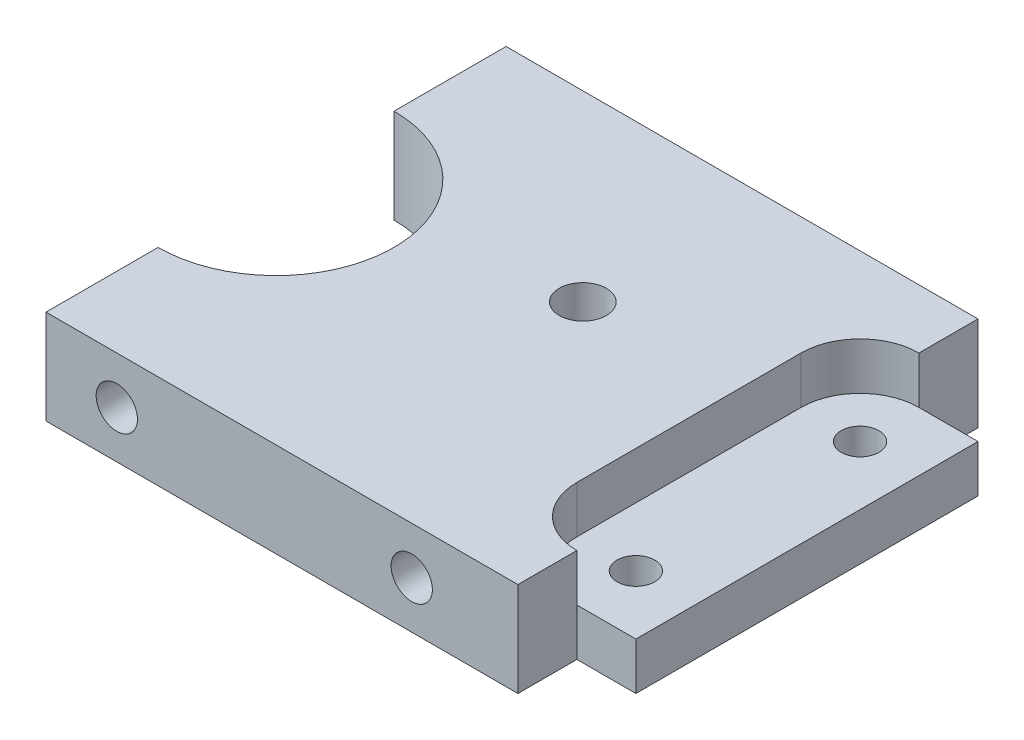
ISO-10303-21;
HEADER;
FILE_DESCRIPTION(('STEP AP214'),'2;1');
FILE_NAME('part.step','',(''),(''),'','','');
FILE_SCHEMA(('AUTOMOTIVE_DESIGN { 1 0 10303 214 1 1 1 1 }'));
ENDSEC;
DATA;
#1=APPLICATION_CONTEXT('core data for automotive mechanical design processes');
#2=APPLICATION_PROTOCOL_DEFINITION('international standard','automotive_design',2000,#1);
#3=PRODUCT_CONTEXT('',#1,'mechanical');
#4=PRODUCT('Part','Part','',(#3));
#5=PRODUCT_RELATED_PRODUCT_CATEGORY('part','',(#4));
#6=PRODUCT_DEFINITION_FORMATION('','',#4);
#7=PRODUCT_DEFINITION_CONTEXT('part definition',#1,'design');
#8=PRODUCT_DEFINITION('design','',#6,#7);
#9=PRODUCT_DEFINITION_SHAPE('','',#8);
#10=(LENGTH_UNIT() NAMED_UNIT(*) SI_UNIT(.MILLI.,.METRE.));
#11=(NAMED_UNIT(*) PLANE_ANGLE_UNIT() SI_UNIT($,.RADIAN.));
#12=(NAMED_UNIT(*) SI_UNIT($,.STERADIAN.) SOLID_ANGLE_UNIT());
#13=UNCERTAINTY_MEASURE_WITH_UNIT(LENGTH_MEASURE(1.E-05),#10,'distance_accuracy_value','');
#14=(GEOMETRIC_REPRESENTATION_CONTEXT(3) GLOBAL_UNCERTAINTY_ASSIGNED_CONTEXT((#13)) GLOBAL_UNIT_ASSIGNED_CONTEXT((#10,
#11,#12)) REPRESENTATION_CONTEXT('',''));
#15=CARTESIAN_POINT('',(0.,0.,0.));
#16=DIRECTION('',(0.,0.,1.));
#17=DIRECTION('',(1.,0.,0.));
#18=AXIS2_PLACEMENT_3D('',#15,#16,#17);
#19=CARTESIAN_POINT('',(13.,-2.,13.5));
#20=DIRECTION('',(-1.,0.,0.));
#21=DIRECTION('',(0.,0.,1.));
#22=AXIS2_PLACEMENT_3D('',#19,#20,#21);
#23=PLANE('',#22);
#24=DIRECTION('',(0.,0.,-1.));
#25=VECTOR('',#24,1.);
#26=CARTESIAN_POINT('',(13.,4.,-5.5));
#27=LINE('',#26,#25);
#28=CARTESIAN_POINT('',(13.,4.,13.5));
#29=VERTEX_POINT('',#28);
#30=CARTESIAN_POINT('',(13.,4.,-5.5));
#31=VERTEX_POINT('',#30);
#32=EDGE_CURVE('E154',#29,#31,#27,.T.);
#33=ORIENTED_EDGE('',*,*,#32,.T.);
#34=DIRECTION('',(0.,1.,0.));
#35=VECTOR('',#34,1.);
#36=CARTESIAN_POINT('',(13.,-2.,-5.5));
#37=LINE('',#36,#35);
#38=CARTESIAN_POINT('',(13.,8.,-5.5));
#39=VERTEX_POINT('',#38);
#40=EDGE_CURVE('E172',#31,#39,#37,.T.);
#41=ORIENTED_EDGE('',*,*,#40,.T.);
#42=DIRECTION('',(0.,0.,1.));
#43=VECTOR('',#42,1.);
#44=CARTESIAN_POINT('',(13.,8.,13.5));
#45=LINE('',#44,#43);
#46=CARTESIAN_POINT('',(13.,8.,13.5));
#47=VERTEX_POINT('',#46);
#48=EDGE_CURVE('E249',#39,#47,#45,.T.);
#49=ORIENTED_EDGE('',*,*,#48,.T.);
#50=DIRECTION('',(0.,1.,0.));
#51=VECTOR('',#50,1.);
#52=CARTESIAN_POINT('',(13.,-2.,13.5));
#53=LINE('',#52,#51);
#54=EDGE_CURVE('E247',#29,#47,#53,.T.);
#55=ORIENTED_EDGE('',*,*,#54,.F.);
#56=EDGE_LOOP('',(#33,#41,#49,#55));
#57=FACE_BOUND('',#56,.T.);
#58=ADVANCED_FACE('F40',(#57),#23,.F.);
#59=CARTESIAN_POINT('',(18.,-2.,13.5));
#60=DIRECTION('',(0.,1.,0.));
#61=DIRECTION('',(0.,0.,1.));
#62=AXIS2_PLACEMENT_3D('',#59,#60,#61);
#63=CYLINDRICAL_SURFACE('',#62,5.);
#64=CARTESIAN_POINT('',(18.,4.,13.5));
#65=DIRECTION('',(0.,-1.,0.));
#66=DIRECTION('',(0.,0.,-1.));
#67=AXIS2_PLACEMENT_3D('',#64,#65,#66);
#68=CIRCLE('',#67,5.);
#69=CARTESIAN_POINT('',(18.,4.,18.5));
#70=VERTEX_POINT('',#69);
#71=EDGE_CURVE('E269',#70,#29,#68,.T.);
#72=ORIENTED_EDGE('',*,*,#71,.T.);
#73=ORIENTED_EDGE('',*,*,#54,.T.);
#74=CARTESIAN_POINT('',(18.,8.,13.5));
#75=DIRECTION('',(0.,1.,0.));
#76=DIRECTION('',(0.,0.,1.));
#77=AXIS2_PLACEMENT_3D('',#74,#75,#76);
#78=CIRCLE('',#77,5.);
#79=CARTESIAN_POINT('',(18.,8.,18.5));
#80=VERTEX_POINT('',#79);
#81=EDGE_CURVE('E255',#47,#80,#78,.T.);
#82=ORIENTED_EDGE('',*,*,#81,.T.);
#83=DIRECTION('',(0.,1.,0.));
#84=VECTOR('',#83,1.);
#85=CARTESIAN_POINT('',(18.,-2.,18.5));
#86=LINE('',#85,#84);
#87=EDGE_CURVE('E48',#70,#80,#86,.T.);
#88=ORIENTED_EDGE('',*,*,#87,.F.);
#89=EDGE_LOOP('',(#72,#73,#82,#88));
#90=FACE_BOUND('',#89,.T.);
#91=ADVANCED_FACE('F314',(#90),#63,.F.);
#92=CARTESIAN_POINT('',(18.,-2.,-5.5));
#93=DIRECTION('',(0.,1.,0.));
#94=DIRECTION('',(0.,0.,1.));
#95=AXIS2_PLACEMENT_3D('',#92,#93,#94);
#96=CYLINDRICAL_SURFACE('',#95,5.);
#97=CARTESIAN_POINT('',(18.,4.,-5.5));
#98=DIRECTION('',(0.,-1.,0.));
#99=DIRECTION('',(0.,0.,-1.));
#100=AXIS2_PLACEMENT_3D('',#97,#98,#99);
#101=CIRCLE('',#100,5.);
#102=CARTESIAN_POINT('',(18.,4.,-10.5));
#103=VERTEX_POINT('',#102);
#104=EDGE_CURVE('E160',#31,#103,#101,.T.);
#105=ORIENTED_EDGE('',*,*,#104,.T.);
#106=DIRECTION('',(0.,1.,0.));
#107=VECTOR('',#106,1.);
#108=CARTESIAN_POINT('',(18.,-2.,-10.5));
#109=LINE('',#108,#107);
#110=CARTESIAN_POINT('',(18.,8.,-10.5));
#111=VERTEX_POINT('',#110);
#112=EDGE_CURVE('E170',#111,#103,#109,.F.);
#113=ORIENTED_EDGE('',*,*,#112,.F.);
#114=CARTESIAN_POINT('',(18.,8.,-5.5));
#115=DIRECTION('',(0.,1.,0.));
#116=DIRECTION('',(0.,0.,1.));
#117=AXIS2_PLACEMENT_3D('',#114,#115,#116);
#118=CIRCLE('',#117,5.);
#119=EDGE_CURVE('E253',#111,#39,#118,.T.);
#120=ORIENTED_EDGE('',*,*,#119,.T.);
#121=ORIENTED_EDGE('',*,*,#40,.F.);
#122=EDGE_LOOP('',(#105,#113,#120,#121));
#123=FACE_BOUND('',#122,.T.);
#124=ADVANCED_FACE('F168',(#123),#96,.F.);
#125=CARTESIAN_POINT('',(18.,8.,-15.5));
#126=DIRECTION('',(-1.,0.,0.));
#127=DIRECTION('',(0.,0.,1.));
#128=AXIS2_PLACEMENT_3D('',#125,#126,#127);
#129=PLANE('',#128);
#130=DIRECTION('',(0.,0.,-1.));
#131=VECTOR('',#130,1.);
#132=CARTESIAN_POINT('',(18.,0.,-15.5));
#133=LINE('',#132,#131);
#134=CARTESIAN_POINT('',(18.,0.,23.5));
#135=VERTEX_POINT('',#134);
#136=CARTESIAN_POINT('',(18.,0.,18.5));
#137=VERTEX_POINT('',#136);
#138=EDGE_CURVE('E196',#135,#137,#133,.T.);
#139=ORIENTED_EDGE('',*,*,#138,.T.);
#140=EDGE_CURVE('E11',#137,#70,#86,.T.);
#141=ORIENTED_EDGE('',*,*,#140,.T.);
#142=ORIENTED_EDGE('',*,*,#87,.T.);
#143=DIRECTION('',(0.,0.,-1.));
#144=VECTOR('',#143,1.);
#145=CARTESIAN_POINT('',(18.,8.,-15.5));
#146=LINE('',#145,#144);
#147=CARTESIAN_POINT('',(18.,8.,23.5));
#148=VERTEX_POINT('',#147);
#149=EDGE_CURVE('E207',#148,#80,#146,.T.);
#150=ORIENTED_EDGE('',*,*,#149,.F.);
#151=DIRECTION('',(0.,-1.,0.));
#152=VECTOR('',#151,1.);
#153=CARTESIAN_POINT('',(18.,8.,23.5));
#154=LINE('',#153,#152);
#155=EDGE_CURVE('E188',#148,#135,#154,.T.);
#156=ORIENTED_EDGE('',*,*,#155,.T.);
#157=EDGE_LOOP('',(#139,#141,#142,#150,#156));
#158=FACE_BOUND('',#157,.T.);
#159=ADVANCED_FACE('F326',(#158),#129,.F.);
#160=CARTESIAN_POINT('',(-22.,8.,-15.5));
#161=DIRECTION('',(1.,0.,0.));
#162=DIRECTION('',(0.,0.,-1.));
#163=AXIS2_PLACEMENT_3D('',#160,#161,#162);
#164=PLANE('',#163);
#165=DIRECTION('',(0.,0.,1.));
#166=VECTOR('',#165,1.);
#167=CARTESIAN_POINT('',(-22.,8.,-15.5));
#168=LINE('',#167,#166);
#169=CARTESIAN_POINT('',(-22.,8.,14.));
#170=VERTEX_POINT('',#169);
#171=CARTESIAN_POINT('',(-22.,8.,23.5));
#172=VERTEX_POINT('',#171);
#173=EDGE_CURVE('E91',#170,#172,#168,.T.);
#174=ORIENTED_EDGE('',*,*,#173,.F.);
#175=DIRECTION('',(0.,-1.,0.));
#176=VECTOR('',#175,1.);
#177=CARTESIAN_POINT('',(-22.,10.,14.));
#178=LINE('',#177,#176);
#179=CARTESIAN_POINT('',(-22.,0.,14.));
#180=VERTEX_POINT('',#179);
#181=EDGE_CURVE('E179',#170,#180,#178,.T.);
#182=ORIENTED_EDGE('',*,*,#181,.T.);
#183=DIRECTION('',(0.,0.,1.));
#184=VECTOR('',#183,1.);
#185=CARTESIAN_POINT('',(-22.,0.,-15.5));
#186=LINE('',#185,#184);
#187=CARTESIAN_POINT('',(-22.,0.,23.5));
#188=VERTEX_POINT('',#187);
#189=EDGE_CURVE('E205',#180,#188,#186,.T.);
#190=ORIENTED_EDGE('',*,*,#189,.T.);
#191=DIRECTION('',(0.,-1.,0.));
#192=VECTOR('',#191,1.);
#193=CARTESIAN_POINT('',(-22.,8.,23.5));
#194=LINE('',#193,#192);
#195=EDGE_CURVE('E185',#172,#188,#194,.T.);
#196=ORIENTED_EDGE('',*,*,#195,.F.);
#197=EDGE_LOOP('',(#174,#182,#190,#196));
#198=FACE_BOUND('',#197,.T.);
#199=ADVANCED_FACE('F370',(#198),#164,.F.);
#200=CARTESIAN_POINT('',(0.,8.,0.));
#201=DIRECTION('',(0.,1.,0.));
#202=DIRECTION('',(0.,0.,1.));
#203=AXIS2_PLACEMENT_3D('',#200,#201,#202);
#204=PLANE('',#203);
#205=ORIENTED_EDGE('',*,*,#81,.F.);
#206=ORIENTED_EDGE('',*,*,#48,.F.);
#207=ORIENTED_EDGE('',*,*,#119,.F.);
#208=CARTESIAN_POINT('',(18.,8.,-15.5));
#209=VERTEX_POINT('',#208);
#210=EDGE_CURVE('E178',#111,#209,#146,.T.);
#211=ORIENTED_EDGE('',*,*,#210,.T.);
#212=DIRECTION('',(-1.,0.,0.));
#213=VECTOR('',#212,1.);
#214=CARTESIAN_POINT('',(-22.,8.,-15.5));
#215=LINE('',#214,#213);
#216=CARTESIAN_POINT('',(-22.,8.,-15.5));
#217=VERTEX_POINT('',#216);
#218=EDGE_CURVE('E64',#209,#217,#215,.T.);
#219=ORIENTED_EDGE('',*,*,#218,.T.);
#220=CARTESIAN_POINT('',(-22.,8.,-6.));
#221=VERTEX_POINT('',#220);
#222=EDGE_CURVE('E212',#217,#221,#168,.T.);
#223=ORIENTED_EDGE('',*,*,#222,.T.);
#224=CARTESIAN_POINT('',(-22.,8.,4.));
#225=DIRECTION('',(0.,1.,0.));
#226=DIRECTION('',(0.,0.,1.));
#227=AXIS2_PLACEMENT_3D('',#224,#225,#226);
#228=CIRCLE('',#227,10.);
#229=EDGE_CURVE('E55',#170,#221,#228,.T.);
#230=ORIENTED_EDGE('',*,*,#229,.F.);
#231=ORIENTED_EDGE('',*,*,#173,.T.);
#232=DIRECTION('',(1.,0.,0.));
#233=VECTOR('',#232,1.);
#234=CARTESIAN_POINT('',(-22.,8.,23.5));
#235=LINE('',#234,#233);
#236=EDGE_CURVE('E210',#172,#148,#235,.T.);
#237=ORIENTED_EDGE('',*,*,#236,.T.);
#238=ORIENTED_EDGE('',*,*,#149,.T.);
#239=EDGE_LOOP('',(#205,#206,#207,#211,#219,#223,#230,#231,#237,#238));
#240=FACE_BOUND('',#239,.T.);
#241=CARTESIAN_POINT('',(0.,8.,0.));
#242=DIRECTION('',(0.,1.,0.));
#243=DIRECTION('',(0.,0.,1.));
#244=AXIS2_PLACEMENT_3D('',#241,#242,#243);
#245=CIRCLE('',#244,2.);
#246=CARTESIAN_POINT('',(0.,8.,2.));
#247=VERTEX_POINT('',#246);
#248=EDGE_CURVE('E217',#247,#247,#245,.T.);
#249=ORIENTED_EDGE('',*,*,#248,.F.);
#250=EDGE_LOOP('',(#249));
#251=FACE_BOUND('',#250,.T.);
#252=ADVANCED_FACE('F300',(#240,#251),#204,.T.);
#253=CARTESIAN_POINT('',(0.,0.,0.));
#254=DIRECTION('',(0.,1.,0.));
#255=DIRECTION('',(0.,0.,1.));
#256=AXIS2_PLACEMENT_3D('',#253,#254,#255);
#257=PLANE('',#256);
#258=DIRECTION('',(-1.,0.,0.));
#259=VECTOR('',#258,1.);
#260=CARTESIAN_POINT('',(18.,0.,18.5));
#261=LINE('',#260,#259);
#262=CARTESIAN_POINT('',(23.,0.,18.5));
#263=VERTEX_POINT('',#262);
#264=EDGE_CURVE('E173',#263,#137,#261,.T.);
#265=ORIENTED_EDGE('',*,*,#264,.T.);
#266=ORIENTED_EDGE('',*,*,#138,.F.);
#267=DIRECTION('',(1.,0.,0.));
#268=VECTOR('',#267,1.);
#269=CARTESIAN_POINT('',(-22.,0.,23.5));
#270=LINE('',#269,#268);
#271=EDGE_CURVE('E200',#188,#135,#270,.T.);
#272=ORIENTED_EDGE('',*,*,#271,.F.);
#273=ORIENTED_EDGE('',*,*,#189,.F.);
#274=CARTESIAN_POINT('',(-22.,0.,4.));
#275=DIRECTION('',(0.,-1.,0.));
#276=DIRECTION('',(0.,0.,-1.));
#277=AXIS2_PLACEMENT_3D('',#274,#275,#276);
#278=CIRCLE('',#277,10.);
#279=CARTESIAN_POINT('',(-22.,0.,-6.));
#280=VERTEX_POINT('',#279);
#281=EDGE_CURVE('E245',#280,#180,#278,.T.);
#282=ORIENTED_EDGE('',*,*,#281,.F.);
#283=CARTESIAN_POINT('',(-22.,0.,-15.5));
#284=VERTEX_POINT('',#283);
#285=EDGE_CURVE('E202',#284,#280,#186,.T.);
#286=ORIENTED_EDGE('',*,*,#285,.F.);
#287=DIRECTION('',(-1.,0.,0.));
#288=VECTOR('',#287,1.);
#289=CARTESIAN_POINT('',(-22.,0.,-15.5));
#290=LINE('',#289,#288);
#291=CARTESIAN_POINT('',(18.,0.,-15.5));
#292=VERTEX_POINT('',#291);
#293=EDGE_CURVE('E85',#292,#284,#290,.T.);
#294=ORIENTED_EDGE('',*,*,#293,.F.);
#295=CARTESIAN_POINT('',(18.,0.,-10.5));
#296=VERTEX_POINT('',#295);
#297=EDGE_CURVE('E199',#296,#292,#133,.T.);
#298=ORIENTED_EDGE('',*,*,#297,.F.);
#299=DIRECTION('',(1.,0.,0.));
#300=VECTOR('',#299,1.);
#301=CARTESIAN_POINT('',(18.,0.,-10.5));
#302=LINE('',#301,#300);
#303=CARTESIAN_POINT('',(23.,0.,-10.5));
#304=VERTEX_POINT('',#303);
#305=EDGE_CURVE('E149',#296,#304,#302,.T.);
#306=ORIENTED_EDGE('',*,*,#305,.T.);
#307=DIRECTION('',(0.,0.,1.));
#308=VECTOR('',#307,1.);
#309=CARTESIAN_POINT('',(23.,0.,-10.5));
#310=LINE('',#309,#308);
#311=EDGE_CURVE('E263',#304,#263,#310,.T.);
#312=ORIENTED_EDGE('',*,*,#311,.T.);
#313=EDGE_LOOP('',(#265,#266,#272,#273,#282,#286,#294,#298,#306,#312));
#314=FACE_BOUND('',#313,.T.);
#315=CARTESIAN_POINT('',(0.,0.,0.));
#316=DIRECTION('',(0.,1.,0.));
#317=DIRECTION('',(0.,0.,1.));
#318=AXIS2_PLACEMENT_3D('',#315,#316,#317);
#319=CIRCLE('',#318,2.);
#320=CARTESIAN_POINT('',(0.,0.,2.));
#321=VERTEX_POINT('',#320);
#322=EDGE_CURVE('E214',#321,#321,#319,.T.);
#323=ORIENTED_EDGE('',*,*,#322,.T.);
#324=EDGE_LOOP('',(#323));
#325=FACE_BOUND('',#324,.T.);
#326=CARTESIAN_POINT('',(18.,0.,-5.5));
#327=DIRECTION('',(0.,-1.,0.));
#328=DIRECTION('',(0.,0.,-1.));
#329=AXIS2_PLACEMENT_3D('',#326,#327,#328);
#330=CIRCLE('',#329,1.6);
#331=CARTESIAN_POINT('',(18.,0.,-7.1));
#332=VERTEX_POINT('',#331);
#333=EDGE_CURVE('E282',#332,#332,#330,.T.);
#334=ORIENTED_EDGE('',*,*,#333,.F.);
#335=EDGE_LOOP('',(#334));
#336=FACE_BOUND('',#335,.T.);
#337=CARTESIAN_POINT('',(18.,0.,13.5));
#338=DIRECTION('',(0.,-1.,0.));
#339=DIRECTION('',(0.,0.,-1.));
#340=AXIS2_PLACEMENT_3D('',#337,#338,#339);
#341=CIRCLE('',#340,1.6);
#342=CARTESIAN_POINT('',(18.,0.,11.9));
#343=VERTEX_POINT('',#342);
#344=EDGE_CURVE('E276',#343,#343,#341,.T.);
#345=ORIENTED_EDGE('',*,*,#344,.F.);
#346=EDGE_LOOP('',(#345));
#347=FACE_BOUND('',#346,.T.);
#348=ADVANCED_FACE('F297',(#314,#325,#336,#347),#257,.F.);
#349=ORIENTED_EDGE('',*,*,#285,.T.);
#350=DIRECTION('',(0.,-1.,0.));
#351=VECTOR('',#350,1.);
#352=CARTESIAN_POINT('',(-22.,10.,-6.));
#353=LINE('',#352,#351);
#354=EDGE_CURVE('E181',#280,#221,#353,.F.);
#355=ORIENTED_EDGE('',*,*,#354,.T.);
#356=ORIENTED_EDGE('',*,*,#222,.F.);
#357=DIRECTION('',(0.,-1.,0.));
#358=VECTOR('',#357,1.);
#359=CARTESIAN_POINT('',(-22.,8.,-15.5));
#360=LINE('',#359,#358);
#361=EDGE_CURVE('E193',#217,#284,#360,.T.);
#362=ORIENTED_EDGE('',*,*,#361,.T.);
#363=EDGE_LOOP('',(#349,#355,#356,#362));
#364=FACE_BOUND('',#363,.T.);
#365=ADVANCED_FACE('F42',(#364),#164,.F.);
#366=CARTESIAN_POINT('',(-22.,8.,23.5));
#367=DIRECTION('',(0.,0.,-1.));
#368=DIRECTION('',(-1.,0.,0.));
#369=AXIS2_PLACEMENT_3D('',#366,#367,#368);
#370=PLANE('',#369);
#371=CARTESIAN_POINT('',(9.,4.,23.5));
#372=DIRECTION('',(0.,0.,1.));
#373=DIRECTION('',(1.,0.,0.));
#374=AXIS2_PLACEMENT_3D('',#371,#372,#373);
#375=CIRCLE('',#374,1.75);
#376=CARTESIAN_POINT('',(10.75,4.,23.5));
#377=VERTEX_POINT('',#376);
#378=EDGE_CURVE('E228',#377,#377,#375,.T.);
#379=ORIENTED_EDGE('',*,*,#378,.F.);
#380=EDGE_LOOP('',(#379));
#381=FACE_BOUND('',#380,.T.);
#382=CARTESIAN_POINT('',(-16.,4.,23.5));
#383=DIRECTION('',(0.,0.,1.));
#384=DIRECTION('',(1.,0.,0.));
#385=AXIS2_PLACEMENT_3D('',#382,#383,#384);
#386=CIRCLE('',#385,1.75);
#387=CARTESIAN_POINT('',(-14.25,4.,23.5));
#388=VERTEX_POINT('',#387);
#389=EDGE_CURVE('E221',#388,#388,#386,.T.);
#390=ORIENTED_EDGE('',*,*,#389,.F.);
#391=EDGE_LOOP('',(#390));
#392=FACE_BOUND('',#391,.T.);
#393=ORIENTED_EDGE('',*,*,#271,.T.);
#394=ORIENTED_EDGE('',*,*,#155,.F.);
#395=ORIENTED_EDGE('',*,*,#236,.F.);
#396=ORIENTED_EDGE('',*,*,#195,.T.);
#397=EDGE_LOOP('',(#393,#394,#395,#396));
#398=FACE_BOUND('',#397,.T.);
#399=ADVANCED_FACE('F376',(#381,#392,#398),#370,.F.);
#400=ORIENTED_EDGE('',*,*,#210,.F.);
#401=ORIENTED_EDGE('',*,*,#112,.T.);
#402=DIRECTION('',(0.,-1.,0.));
#403=VECTOR('',#402,1.);
#404=CARTESIAN_POINT('',(18.,4.,-10.5));
#405=LINE('',#404,#403);
#406=EDGE_CURVE('E144',#103,#296,#405,.T.);
#407=ORIENTED_EDGE('',*,*,#406,.T.);
#408=ORIENTED_EDGE('',*,*,#297,.T.);
#409=DIRECTION('',(0.,-1.,0.));
#410=VECTOR('',#409,1.);
#411=CARTESIAN_POINT('',(18.,8.,-15.5));
#412=LINE('',#411,#410);
#413=EDGE_CURVE('E191',#209,#292,#412,.T.);
#414=ORIENTED_EDGE('',*,*,#413,.F.);
#415=EDGE_LOOP('',(#400,#401,#407,#408,#414));
#416=FACE_BOUND('',#415,.T.);
#417=ADVANCED_FACE('F176',(#416),#129,.F.);
#418=CARTESIAN_POINT('',(-22.,8.,-15.5));
#419=DIRECTION('',(0.,0.,1.));
#420=DIRECTION('',(1.,0.,0.));
#421=AXIS2_PLACEMENT_3D('',#418,#419,#420);
#422=PLANE('',#421);
#423=CARTESIAN_POINT('',(9.,4.,-15.5));
#424=DIRECTION('',(0.,0.,1.));
#425=DIRECTION('',(1.,0.,0.));
#426=AXIS2_PLACEMENT_3D('',#423,#424,#425);
#427=CIRCLE('',#426,1.75);
#428=CARTESIAN_POINT('',(10.75,4.,-15.5));
#429=VERTEX_POINT('',#428);
#430=EDGE_CURVE('E239',#429,#429,#427,.T.);
#431=ORIENTED_EDGE('',*,*,#430,.T.);
#432=EDGE_LOOP('',(#431));
#433=FACE_BOUND('',#432,.T.);
#434=CARTESIAN_POINT('',(-16.,4.,-15.5));
#435=DIRECTION('',(0.,0.,1.));
#436=DIRECTION('',(1.,0.,0.));
#437=AXIS2_PLACEMENT_3D('',#434,#435,#436);
#438=CIRCLE('',#437,1.75);
#439=CARTESIAN_POINT('',(-14.25,4.,-15.5));
#440=VERTEX_POINT('',#439);
#441=EDGE_CURVE('E233',#440,#440,#438,.T.);
#442=ORIENTED_EDGE('',*,*,#441,.T.);
#443=EDGE_LOOP('',(#442));
#444=FACE_BOUND('',#443,.T.);
#445=ORIENTED_EDGE('',*,*,#293,.T.);
#446=ORIENTED_EDGE('',*,*,#361,.F.);
#447=ORIENTED_EDGE('',*,*,#218,.F.);
#448=ORIENTED_EDGE('',*,*,#413,.T.);
#449=EDGE_LOOP('',(#445,#446,#447,#448));
#450=FACE_BOUND('',#449,.T.);
#451=ADVANCED_FACE('F367',(#433,#444,#450),#422,.F.);
#452=CARTESIAN_POINT('',(0.,8.,0.));
#453=DIRECTION('',(0.,-1.,0.));
#454=DIRECTION('',(0.,0.,-1.));
#455=AXIS2_PLACEMENT_3D('',#452,#453,#454);
#456=CYLINDRICAL_SURFACE('',#455,2.);
#457=ORIENTED_EDGE('',*,*,#248,.T.);
#458=EDGE_LOOP('',(#457));
#459=FACE_BOUND('',#458,.T.);
#460=ORIENTED_EDGE('',*,*,#322,.F.);
#461=EDGE_LOOP('',(#460));
#462=FACE_BOUND('',#461,.T.);
#463=ADVANCED_FACE('F363',(#459,#462),#456,.F.);
#464=CARTESIAN_POINT('',(-16.,4.,15.5));
#465=DIRECTION('',(0.,0.,1.));
#466=DIRECTION('',(1.,0.,0.));
#467=AXIS2_PLACEMENT_3D('',#464,#465,#466);
#468=CYLINDRICAL_SURFACE('',#467,1.75);
#469=CARTESIAN_POINT('',(-16.,4.,15.5));
#470=DIRECTION('',(0.,0.,1.));
#471=DIRECTION('',(1.,0.,0.));
#472=AXIS2_PLACEMENT_3D('',#469,#470,#471);
#473=CIRCLE('',#472,1.75);
#474=CARTESIAN_POINT('',(-14.25,4.,15.5));
#475=VERTEX_POINT('',#474);
#476=EDGE_CURVE('E224',#475,#475,#473,.T.);
#477=ORIENTED_EDGE('',*,*,#476,.F.);
#478=EDGE_LOOP('',(#477));
#479=FACE_BOUND('',#478,.T.);
#480=ORIENTED_EDGE('',*,*,#389,.T.);
#481=EDGE_LOOP('',(#480));
#482=FACE_BOUND('',#481,.T.);
#483=ADVANCED_FACE('F359',(#479,#482),#468,.F.);
#484=CARTESIAN_POINT('',(-16.,4.,15.5));
#485=DIRECTION('',(0.,0.,1.));
#486=DIRECTION('',(1.,0.,0.));
#487=AXIS2_PLACEMENT_3D('',#484,#485,#486);
#488=PLANE('',#487);
#489=ORIENTED_EDGE('',*,*,#476,.T.);
#490=EDGE_LOOP('',(#489));
#491=FACE_BOUND('',#490,.T.);
#492=ADVANCED_FACE('F355',(#491),#488,.T.);
#493=CARTESIAN_POINT('',(9.,4.,15.5));
#494=DIRECTION('',(0.,0.,1.));
#495=DIRECTION('',(1.,0.,0.));
#496=AXIS2_PLACEMENT_3D('',#493,#494,#495);
#497=CYLINDRICAL_SURFACE('',#496,1.75);
#498=CARTESIAN_POINT('',(9.,4.,15.5));
#499=DIRECTION('',(0.,0.,1.));
#500=DIRECTION('',(1.,0.,0.));
#501=AXIS2_PLACEMENT_3D('',#498,#499,#500);
#502=CIRCLE('',#501,1.75);
#503=CARTESIAN_POINT('',(10.75,4.,15.5));
#504=VERTEX_POINT('',#503);
#505=EDGE_CURVE('E218',#504,#504,#502,.T.);
#506=ORIENTED_EDGE('',*,*,#505,.F.);
#507=EDGE_LOOP('',(#506));
#508=FACE_BOUND('',#507,.T.);
#509=ORIENTED_EDGE('',*,*,#378,.T.);
#510=EDGE_LOOP('',(#509));
#511=FACE_BOUND('',#510,.T.);
#512=ADVANCED_FACE('F351',(#508,#511),#497,.F.);
#513=CARTESIAN_POINT('',(9.,4.,15.5));
#514=DIRECTION('',(0.,0.,1.));
#515=DIRECTION('',(1.,0.,0.));
#516=AXIS2_PLACEMENT_3D('',#513,#514,#515);
#517=PLANE('',#516);
#518=ORIENTED_EDGE('',*,*,#505,.T.);
#519=EDGE_LOOP('',(#518));
#520=FACE_BOUND('',#519,.T.);
#521=ADVANCED_FACE('F347',(#520),#517,.T.);
#522=CARTESIAN_POINT('',(-16.,4.,-7.5));
#523=DIRECTION('',(0.,0.,-1.));
#524=DIRECTION('',(-1.,0.,0.));
#525=AXIS2_PLACEMENT_3D('',#522,#523,#524);
#526=CYLINDRICAL_SURFACE('',#525,1.75);
#527=CARTESIAN_POINT('',(-16.,4.,-7.5));
#528=DIRECTION('',(0.,0.,1.));
#529=DIRECTION('',(1.,0.,0.));
#530=AXIS2_PLACEMENT_3D('',#527,#528,#529);
#531=CIRCLE('',#530,1.75);
#532=CARTESIAN_POINT('',(-14.25,4.,-7.5));
#533=VERTEX_POINT('',#532);
#534=EDGE_CURVE('E236',#533,#533,#531,.T.);
#535=ORIENTED_EDGE('',*,*,#534,.T.);
#536=EDGE_LOOP('',(#535));
#537=FACE_BOUND('',#536,.T.);
#538=ORIENTED_EDGE('',*,*,#441,.F.);
#539=EDGE_LOOP('',(#538));
#540=FACE_BOUND('',#539,.T.);
#541=ADVANCED_FACE('F343',(#537,#540),#526,.F.);
#542=CARTESIAN_POINT('',(-16.,4.,-7.5));
#543=DIRECTION('',(0.,0.,1.));
#544=DIRECTION('',(1.,0.,0.));
#545=AXIS2_PLACEMENT_3D('',#542,#543,#544);
#546=PLANE('',#545);
#547=ORIENTED_EDGE('',*,*,#534,.F.);
#548=EDGE_LOOP('',(#547));
#549=FACE_BOUND('',#548,.T.);
#550=ADVANCED_FACE('F339',(#549),#546,.F.);
#551=CARTESIAN_POINT('',(9.,4.,-7.5));
#552=DIRECTION('',(0.,0.,-1.));
#553=DIRECTION('',(-1.,0.,0.));
#554=AXIS2_PLACEMENT_3D('',#551,#552,#553);
#555=CYLINDRICAL_SURFACE('',#554,1.75);
#556=CARTESIAN_POINT('',(9.,4.,-7.5));
#557=DIRECTION('',(0.,0.,1.));
#558=DIRECTION('',(1.,0.,0.));
#559=AXIS2_PLACEMENT_3D('',#556,#557,#558);
#560=CIRCLE('',#559,1.75);
#561=CARTESIAN_POINT('',(10.75,4.,-7.5));
#562=VERTEX_POINT('',#561);
#563=EDGE_CURVE('E225',#562,#562,#560,.T.);
#564=ORIENTED_EDGE('',*,*,#563,.T.);
#565=EDGE_LOOP('',(#564));
#566=FACE_BOUND('',#565,.T.);
#567=ORIENTED_EDGE('',*,*,#430,.F.);
#568=EDGE_LOOP('',(#567));
#569=FACE_BOUND('',#568,.T.);
#570=ADVANCED_FACE('F335',(#566,#569),#555,.F.);
#571=CARTESIAN_POINT('',(9.,4.,-7.5));
#572=DIRECTION('',(0.,0.,1.));
#573=DIRECTION('',(1.,0.,0.));
#574=AXIS2_PLACEMENT_3D('',#571,#572,#573);
#575=PLANE('',#574);
#576=ORIENTED_EDGE('',*,*,#563,.F.);
#577=EDGE_LOOP('',(#576));
#578=FACE_BOUND('',#577,.T.);
#579=ADVANCED_FACE('F332',(#578),#575,.F.);
#580=CARTESIAN_POINT('',(-22.,10.,4.));
#581=DIRECTION('',(0.,-1.,0.));
#582=DIRECTION('',(0.,0.,-1.));
#583=AXIS2_PLACEMENT_3D('',#580,#581,#582);
#584=CYLINDRICAL_SURFACE('',#583,10.);
#585=ORIENTED_EDGE('',*,*,#229,.T.);
#586=ORIENTED_EDGE('',*,*,#354,.F.);
#587=ORIENTED_EDGE('',*,*,#281,.T.);
#588=ORIENTED_EDGE('',*,*,#181,.F.);
#589=EDGE_LOOP('',(#585,#586,#587,#588));
#590=FACE_BOUND('',#589,.T.);
#591=ADVANCED_FACE('F328',(#590),#584,.F.);
#592=CARTESIAN_POINT('',(18.,4.,18.5));
#593=DIRECTION('',(0.,0.,1.));
#594=DIRECTION('',(1.,0.,0.));
#595=AXIS2_PLACEMENT_3D('',#592,#593,#594);
#596=PLANE('',#595);
#597=ORIENTED_EDGE('',*,*,#264,.F.);
#598=DIRECTION('',(0.,-1.,0.));
#599=VECTOR('',#598,1.);
#600=CARTESIAN_POINT('',(23.,4.,18.5));
#601=LINE('',#600,#599);
#602=CARTESIAN_POINT('',(23.,4.,18.5));
#603=VERTEX_POINT('',#602);
#604=EDGE_CURVE('E257',#603,#263,#601,.T.);
#605=ORIENTED_EDGE('',*,*,#604,.F.);
#606=DIRECTION('',(-1.,0.,0.));
#607=VECTOR('',#606,1.);
#608=CARTESIAN_POINT('',(18.,4.,18.5));
#609=LINE('',#608,#607);
#610=EDGE_CURVE('E272',#603,#70,#609,.T.);
#611=ORIENTED_EDGE('',*,*,#610,.T.);
#612=ORIENTED_EDGE('',*,*,#140,.F.);
#613=EDGE_LOOP('',(#597,#605,#611,#612));
#614=FACE_BOUND('',#613,.T.);
#615=ADVANCED_FACE('F331',(#614),#596,.T.);
#616=CARTESIAN_POINT('',(23.,4.,-10.5));
#617=DIRECTION('',(1.,0.,0.));
#618=DIRECTION('',(0.,0.,-1.));
#619=AXIS2_PLACEMENT_3D('',#616,#617,#618);
#620=PLANE('',#619);
#621=ORIENTED_EDGE('',*,*,#311,.F.);
#622=DIRECTION('',(0.,-1.,0.));
#623=VECTOR('',#622,1.);
#624=CARTESIAN_POINT('',(23.,4.,-10.5));
#625=LINE('',#624,#623);
#626=CARTESIAN_POINT('',(23.,4.,-10.5));
#627=VERTEX_POINT('',#626);
#628=EDGE_CURVE('E153',#627,#304,#625,.T.);
#629=ORIENTED_EDGE('',*,*,#628,.F.);
#630=DIRECTION('',(0.,0.,1.));
#631=VECTOR('',#630,1.);
#632=CARTESIAN_POINT('',(23.,4.,-10.5));
#633=LINE('',#632,#631);
#634=EDGE_CURVE('E164',#627,#603,#633,.T.);
#635=ORIENTED_EDGE('',*,*,#634,.T.);
#636=ORIENTED_EDGE('',*,*,#604,.T.);
#637=EDGE_LOOP('',(#621,#629,#635,#636));
#638=FACE_BOUND('',#637,.T.);
#639=ADVANCED_FACE('F581',(#638),#620,.T.);
#640=CARTESIAN_POINT('',(18.,4.,-10.5));
#641=DIRECTION('',(0.,0.,-1.));
#642=DIRECTION('',(-1.,0.,0.));
#643=AXIS2_PLACEMENT_3D('',#640,#641,#642);
#644=PLANE('',#643);
#645=ORIENTED_EDGE('',*,*,#305,.F.);
#646=ORIENTED_EDGE('',*,*,#406,.F.);
#647=DIRECTION('',(1.,0.,0.));
#648=VECTOR('',#647,1.);
#649=CARTESIAN_POINT('',(18.,4.,-10.5));
#650=LINE('',#649,#648);
#651=EDGE_CURVE('E147',#103,#627,#650,.T.);
#652=ORIENTED_EDGE('',*,*,#651,.T.);
#653=ORIENTED_EDGE('',*,*,#628,.T.);
#654=EDGE_LOOP('',(#645,#646,#652,#653));
#655=FACE_BOUND('',#654,.T.);
#656=ADVANCED_FACE('F146',(#655),#644,.T.);
#657=CARTESIAN_POINT('',(18.,4.,-5.5));
#658=DIRECTION('',(0.,-1.,0.));
#659=DIRECTION('',(0.,0.,-1.));
#660=AXIS2_PLACEMENT_3D('',#657,#658,#659);
#661=PLANE('',#660);
#662=CARTESIAN_POINT('',(18.,4.,-5.5));
#663=DIRECTION('',(0.,-1.,0.));
#664=DIRECTION('',(0.,0.,-1.));
#665=AXIS2_PLACEMENT_3D('',#662,#663,#664);
#666=CIRCLE('',#665,1.6);
#667=CARTESIAN_POINT('',(18.,4.,-7.1));
#668=VERTEX_POINT('',#667);
#669=EDGE_CURVE('E279',#668,#668,#666,.T.);
#670=ORIENTED_EDGE('',*,*,#669,.T.);
#671=EDGE_LOOP('',(#670));
#672=FACE_BOUND('',#671,.T.);
#673=CARTESIAN_POINT('',(18.,4.,13.5));
#674=DIRECTION('',(0.,-1.,0.));
#675=DIRECTION('',(0.,0.,-1.));
#676=AXIS2_PLACEMENT_3D('',#673,#674,#675);
#677=CIRCLE('',#676,1.6);
#678=CARTESIAN_POINT('',(18.,4.,11.9));
#679=VERTEX_POINT('',#678);
#680=EDGE_CURVE('E267',#679,#679,#677,.T.);
#681=ORIENTED_EDGE('',*,*,#680,.T.);
#682=EDGE_LOOP('',(#681));
#683=FACE_BOUND('',#682,.T.);
#684=ORIENTED_EDGE('',*,*,#104,.F.);
#685=ORIENTED_EDGE('',*,*,#32,.F.);
#686=ORIENTED_EDGE('',*,*,#71,.F.);
#687=ORIENTED_EDGE('',*,*,#610,.F.);
#688=ORIENTED_EDGE('',*,*,#634,.F.);
#689=ORIENTED_EDGE('',*,*,#651,.F.);
#690=EDGE_LOOP('',(#684,#685,#686,#687,#688,#689));
#691=FACE_BOUND('',#690,.T.);
#692=ADVANCED_FACE('F159',(#672,#683,#691),#661,.F.);
#693=CARTESIAN_POINT('',(18.,4.,13.5));
#694=DIRECTION('',(0.,-1.,0.));
#695=DIRECTION('',(0.,0.,-1.));
#696=AXIS2_PLACEMENT_3D('',#693,#694,#695);
#697=CYLINDRICAL_SURFACE('',#696,1.6);
#698=ORIENTED_EDGE('',*,*,#680,.F.);
#699=EDGE_LOOP('',(#698));
#700=FACE_BOUND('',#699,.T.);
#701=ORIENTED_EDGE('',*,*,#344,.T.);
#702=EDGE_LOOP('',(#701));
#703=FACE_BOUND('',#702,.T.);
#704=ADVANCED_FACE('F293',(#700,#703),#697,.F.);
#705=CARTESIAN_POINT('',(18.,4.,-5.5));
#706=DIRECTION('',(0.,-1.,0.));
#707=DIRECTION('',(0.,0.,-1.));
#708=AXIS2_PLACEMENT_3D('',#705,#706,#707);
#709=CYLINDRICAL_SURFACE('',#708,1.6);
#710=ORIENTED_EDGE('',*,*,#669,.F.);
#711=EDGE_LOOP('',(#710));
#712=FACE_BOUND('',#711,.T.);
#713=ORIENTED_EDGE('',*,*,#333,.T.);
#714=EDGE_LOOP('',(#713));
#715=FACE_BOUND('',#714,.T.);
#716=ADVANCED_FACE('F290',(#712,#715),#709,.F.);
#717=CLOSED_SHELL('',(#58,#91,#124,#159,#199,#252,#348,#365,#399,#417,#451,#463,#483,#492,#512,
#521,#541,#550,#570,#579,#591,#615,#639,#656,#692,#704,#716));
#718=MANIFOLD_SOLID_BREP('B2',#717);
#719=ADVANCED_BREP_SHAPE_REPRESENTATION('',(#18,#718),#14);
#720=SHAPE_DEFINITION_REPRESENTATION(#9,#719);
ENDSEC;
END-ISO-10303-21;
